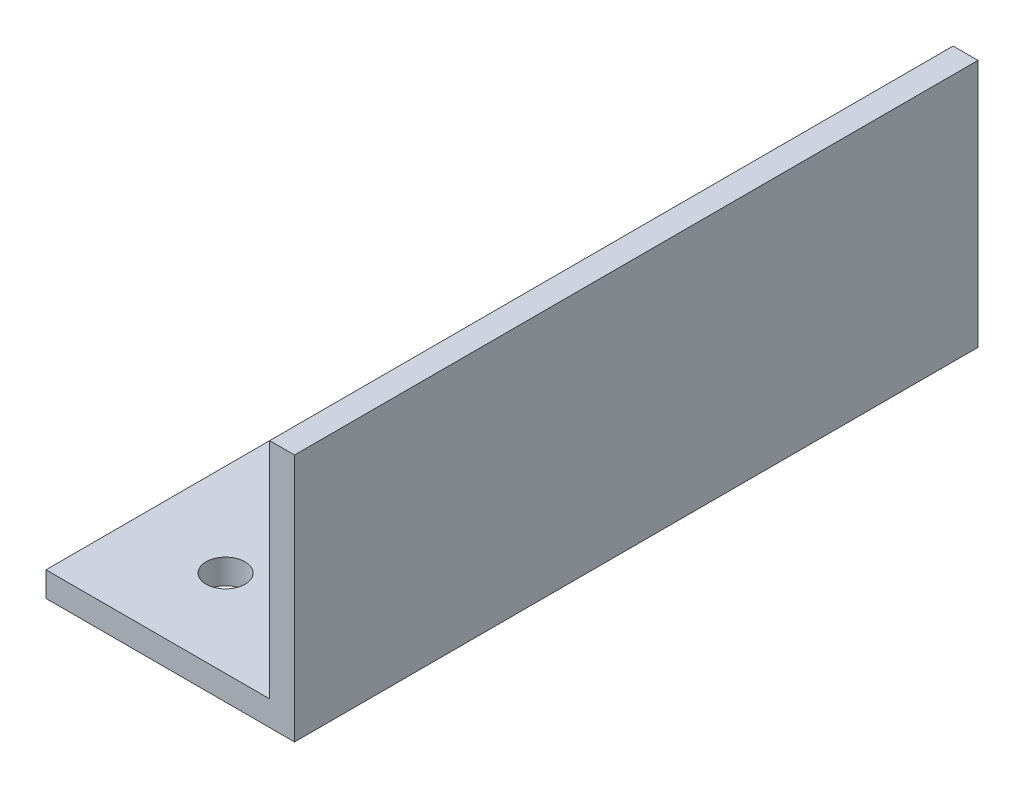
ISO-10303-21;
HEADER;
FILE_DESCRIPTION(('STEP AP214'),'2;1');
FILE_NAME('part.step','',(''),(''),'','','');
FILE_SCHEMA(('AUTOMOTIVE_DESIGN { 1 0 10303 214 1 1 1 1 }'));
ENDSEC;
DATA;
#1=APPLICATION_CONTEXT('core data for automotive mechanical design processes');
#2=APPLICATION_PROTOCOL_DEFINITION('international standard','automotive_design',2000,#1);
#3=PRODUCT_CONTEXT('',#1,'mechanical');
#4=PRODUCT('Part','Part','',(#3));
#5=PRODUCT_RELATED_PRODUCT_CATEGORY('part','',(#4));
#6=PRODUCT_DEFINITION_FORMATION('','',#4);
#7=PRODUCT_DEFINITION_CONTEXT('part definition',#1,'design');
#8=PRODUCT_DEFINITION('design','',#6,#7);
#9=PRODUCT_DEFINITION_SHAPE('','',#8);
#10=(LENGTH_UNIT() NAMED_UNIT(*) SI_UNIT(.MILLI.,.METRE.));
#11=(NAMED_UNIT(*) PLANE_ANGLE_UNIT() SI_UNIT($,.RADIAN.));
#12=(NAMED_UNIT(*) SI_UNIT($,.STERADIAN.) SOLID_ANGLE_UNIT());
#13=UNCERTAINTY_MEASURE_WITH_UNIT(LENGTH_MEASURE(1.E-05),#10,'distance_accuracy_value','');
#14=(GEOMETRIC_REPRESENTATION_CONTEXT(3) GLOBAL_UNCERTAINTY_ASSIGNED_CONTEXT((#13)) GLOBAL_UNIT_ASSIGNED_CONTEXT((#10,
#11,#12)) REPRESENTATION_CONTEXT('',''));
#15=CARTESIAN_POINT('',(0.,0.,0.));
#16=DIRECTION('',(0.,0.,1.));
#17=DIRECTION('',(1.,0.,0.));
#18=AXIS2_PLACEMENT_3D('',#15,#16,#17);
#19=CARTESIAN_POINT('',(-18.,0.,55.));
#20=DIRECTION('',(-1.,0.,0.));
#21=DIRECTION('',(0.,0.,1.));
#22=AXIS2_PLACEMENT_3D('',#19,#20,#21);
#23=PLANE('',#22);
#24=DIRECTION('',(0.,1.,0.));
#25=VECTOR('',#24,1.);
#26=CARTESIAN_POINT('',(-18.,0.,0.));
#27=LINE('',#26,#25);
#28=CARTESIAN_POINT('',(-18.,0.,0.));
#29=VERTEX_POINT('',#28);
#30=CARTESIAN_POINT('',(-18.,2.,0.));
#31=VERTEX_POINT('',#30);
#32=EDGE_CURVE('E132',#29,#31,#27,.T.);
#33=ORIENTED_EDGE('',*,*,#32,.F.);
#34=DIRECTION('',(0.,0.,-1.));
#35=VECTOR('',#34,1.);
#36=CARTESIAN_POINT('',(-18.,0.,55.));
#37=LINE('',#36,#35);
#38=CARTESIAN_POINT('',(-18.,0.,55.));
#39=VERTEX_POINT('',#38);
#40=EDGE_CURVE('E13',#39,#29,#37,.T.);
#41=ORIENTED_EDGE('',*,*,#40,.F.);
#42=DIRECTION('',(0.,1.,0.));
#43=VECTOR('',#42,1.);
#44=CARTESIAN_POINT('',(-18.,0.,55.));
#45=LINE('',#44,#43);
#46=CARTESIAN_POINT('',(-18.,2.,55.));
#47=VERTEX_POINT('',#46);
#48=EDGE_CURVE('E147',#39,#47,#45,.T.);
#49=ORIENTED_EDGE('',*,*,#48,.T.);
#50=DIRECTION('',(0.,0.,-1.));
#51=VECTOR('',#50,1.);
#52=CARTESIAN_POINT('',(-18.,2.,55.));
#53=LINE('',#52,#51);
#54=EDGE_CURVE('E95',#47,#31,#53,.T.);
#55=ORIENTED_EDGE('',*,*,#54,.T.);
#56=EDGE_LOOP('',(#33,#41,#49,#55));
#57=FACE_BOUND('',#56,.T.);
#58=ADVANCED_FACE('F49',(#57),#23,.T.);
#59=CARTESIAN_POINT('',(0.,0.,55.));
#60=DIRECTION('',(0.,-1.,0.));
#61=DIRECTION('',(1.,0.,0.));
#62=AXIS2_PLACEMENT_3D('',#59,#60,#61);
#63=PLANE('',#62);
#64=CARTESIAN_POINT('',(-10.5501572342593,0.,48.0000000000007));
#65=DIRECTION('',(0.,-1.,0.));
#66=DIRECTION('',(1.,0.,0.));
#67=AXIS2_PLACEMENT_3D('',#64,#65,#66);
#68=CIRCLE('',#67,1.5661800246503);
#69=CARTESIAN_POINT('',(-8.98397720960897,0.,48.0000000000007));
#70=VERTEX_POINT('',#69);
#71=EDGE_CURVE('E160',#70,#70,#68,.T.);
#72=ORIENTED_EDGE('',*,*,#71,.F.);
#73=EDGE_LOOP('',(#72));
#74=FACE_BOUND('',#73,.T.);
#75=CARTESIAN_POINT('',(-10.5501572342593,0.,7.00000000000067));
#76=DIRECTION('',(0.,-1.,0.));
#77=DIRECTION('',(1.,0.,0.));
#78=AXIS2_PLACEMENT_3D('',#75,#76,#77);
#79=CIRCLE('',#78,1.5661800246503);
#80=CARTESIAN_POINT('',(-8.98397720960897,0.,7.00000000000067));
#81=VERTEX_POINT('',#80);
#82=EDGE_CURVE('E152',#81,#81,#79,.T.);
#83=ORIENTED_EDGE('',*,*,#82,.F.);
#84=EDGE_LOOP('',(#83));
#85=FACE_BOUND('',#84,.T.);
#86=DIRECTION('',(-1.,0.,0.));
#87=VECTOR('',#86,1.);
#88=CARTESIAN_POINT('',(0.,0.,0.));
#89=LINE('',#88,#87);
#90=CARTESIAN_POINT('',(2.,0.,0.));
#91=VERTEX_POINT('',#90);
#92=EDGE_CURVE('E135',#91,#29,#89,.T.);
#93=ORIENTED_EDGE('',*,*,#92,.F.);
#94=DIRECTION('',(0.,0.,-1.));
#95=VECTOR('',#94,1.);
#96=CARTESIAN_POINT('',(2.,0.,55.));
#97=LINE('',#96,#95);
#98=CARTESIAN_POINT('',(2.,0.,55.));
#99=VERTEX_POINT('',#98);
#100=EDGE_CURVE('E58',#99,#91,#97,.T.);
#101=ORIENTED_EDGE('',*,*,#100,.F.);
#102=DIRECTION('',(-1.,0.,0.));
#103=VECTOR('',#102,1.);
#104=CARTESIAN_POINT('',(0.,0.,55.));
#105=LINE('',#104,#103);
#106=EDGE_CURVE('E164',#99,#39,#105,.T.);
#107=ORIENTED_EDGE('',*,*,#106,.T.);
#108=ORIENTED_EDGE('',*,*,#40,.T.);
#109=EDGE_LOOP('',(#93,#101,#107,#108));
#110=FACE_BOUND('',#109,.T.);
#111=ADVANCED_FACE('F168',(#74,#85,#110),#63,.T.);
#112=CARTESIAN_POINT('',(2.,0.,55.));
#113=DIRECTION('',(-1.,0.,0.));
#114=DIRECTION('',(0.,-1.,0.));
#115=AXIS2_PLACEMENT_3D('',#112,#113,#114);
#116=PLANE('',#115);
#117=DIRECTION('',(0.,1.,0.));
#118=VECTOR('',#117,1.);
#119=CARTESIAN_POINT('',(2.,0.,0.));
#120=LINE('',#119,#118);
#121=CARTESIAN_POINT('',(2.,20.,0.));
#122=VERTEX_POINT('',#121);
#123=EDGE_CURVE('E139',#91,#122,#120,.T.);
#124=ORIENTED_EDGE('',*,*,#123,.T.);
#125=DIRECTION('',(0.,0.,-1.));
#126=VECTOR('',#125,1.);
#127=CARTESIAN_POINT('',(2.,20.,55.));
#128=LINE('',#127,#126);
#129=CARTESIAN_POINT('',(2.,20.,55.));
#130=VERTEX_POINT('',#129);
#131=EDGE_CURVE('E118',#130,#122,#128,.T.);
#132=ORIENTED_EDGE('',*,*,#131,.F.);
#133=DIRECTION('',(0.,1.,0.));
#134=VECTOR('',#133,1.);
#135=CARTESIAN_POINT('',(2.,0.,55.));
#136=LINE('',#135,#134);
#137=EDGE_CURVE('E124',#99,#130,#136,.T.);
#138=ORIENTED_EDGE('',*,*,#137,.F.);
#139=ORIENTED_EDGE('',*,*,#100,.T.);
#140=EDGE_LOOP('',(#124,#132,#138,#139));
#141=FACE_BOUND('',#140,.T.);
#142=ADVANCED_FACE('F173',(#141),#116,.F.);
#143=CARTESIAN_POINT('',(0.,20.,55.));
#144=DIRECTION('',(0.,1.,0.));
#145=DIRECTION('',(0.,0.,1.));
#146=AXIS2_PLACEMENT_3D('',#143,#144,#145);
#147=PLANE('',#146);
#148=DIRECTION('',(1.,0.,0.));
#149=VECTOR('',#148,1.);
#150=CARTESIAN_POINT('',(0.,20.,0.));
#151=LINE('',#150,#149);
#152=CARTESIAN_POINT('',(0.,20.,0.));
#153=VERTEX_POINT('',#152);
#154=EDGE_CURVE('E113',#153,#122,#151,.T.);
#155=ORIENTED_EDGE('',*,*,#154,.F.);
#156=DIRECTION('',(0.,0.,-1.));
#157=VECTOR('',#156,1.);
#158=CARTESIAN_POINT('',(0.,20.,55.));
#159=LINE('',#158,#157);
#160=CARTESIAN_POINT('',(0.,20.,55.));
#161=VERTEX_POINT('',#160);
#162=EDGE_CURVE('E108',#161,#153,#159,.T.);
#163=ORIENTED_EDGE('',*,*,#162,.F.);
#164=DIRECTION('',(1.,0.,0.));
#165=VECTOR('',#164,1.);
#166=CARTESIAN_POINT('',(0.,20.,55.));
#167=LINE('',#166,#165);
#168=EDGE_CURVE('E111',#161,#130,#167,.T.);
#169=ORIENTED_EDGE('',*,*,#168,.T.);
#170=ORIENTED_EDGE('',*,*,#131,.T.);
#171=EDGE_LOOP('',(#155,#163,#169,#170));
#172=FACE_BOUND('',#171,.T.);
#173=ADVANCED_FACE('F110',(#172),#147,.T.);
#174=CARTESIAN_POINT('',(0.,0.,55.));
#175=DIRECTION('',(-1.,0.,0.));
#176=DIRECTION('',(0.,0.,1.));
#177=AXIS2_PLACEMENT_3D('',#174,#175,#176);
#178=PLANE('',#177);
#179=DIRECTION('',(0.,1.,0.));
#180=VECTOR('',#179,1.);
#181=CARTESIAN_POINT('',(0.,0.,0.));
#182=LINE('',#181,#180);
#183=CARTESIAN_POINT('',(0.,2.,0.));
#184=VERTEX_POINT('',#183);
#185=EDGE_CURVE('E143',#184,#153,#182,.T.);
#186=ORIENTED_EDGE('',*,*,#185,.F.);
#187=DIRECTION('',(0.,0.,-1.));
#188=VECTOR('',#187,1.);
#189=CARTESIAN_POINT('',(0.,2.,55.));
#190=LINE('',#189,#188);
#191=CARTESIAN_POINT('',(0.,2.,55.));
#192=VERTEX_POINT('',#191);
#193=EDGE_CURVE('E88',#192,#184,#190,.T.);
#194=ORIENTED_EDGE('',*,*,#193,.F.);
#195=DIRECTION('',(0.,1.,0.));
#196=VECTOR('',#195,1.);
#197=CARTESIAN_POINT('',(0.,0.,55.));
#198=LINE('',#197,#196);
#199=EDGE_CURVE('E121',#192,#161,#198,.T.);
#200=ORIENTED_EDGE('',*,*,#199,.T.);
#201=ORIENTED_EDGE('',*,*,#162,.T.);
#202=EDGE_LOOP('',(#186,#194,#200,#201));
#203=FACE_BOUND('',#202,.T.);
#204=ADVANCED_FACE('F127',(#203),#178,.T.);
#205=CARTESIAN_POINT('',(0.,2.,55.));
#206=DIRECTION('',(0.,-1.,0.));
#207=DIRECTION('',(1.,0.,0.));
#208=AXIS2_PLACEMENT_3D('',#205,#206,#207);
#209=PLANE('',#208);
#210=CARTESIAN_POINT('',(-10.5501572342593,2.,48.0000000000007));
#211=DIRECTION('',(0.,-1.,0.));
#212=DIRECTION('',(1.,0.,0.));
#213=AXIS2_PLACEMENT_3D('',#210,#211,#212);
#214=CIRCLE('',#213,1.5661800246503);
#215=CARTESIAN_POINT('',(-8.98397720960897,2.,48.0000000000007));
#216=VERTEX_POINT('',#215);
#217=EDGE_CURVE('E52',#216,#216,#214,.T.);
#218=ORIENTED_EDGE('',*,*,#217,.T.);
#219=EDGE_LOOP('',(#218));
#220=FACE_BOUND('',#219,.T.);
#221=CARTESIAN_POINT('',(-10.5501572342593,2.,7.00000000000067));
#222=DIRECTION('',(0.,-1.,0.));
#223=DIRECTION('',(1.,0.,0.));
#224=AXIS2_PLACEMENT_3D('',#221,#222,#223);
#225=CIRCLE('',#224,1.5661800246503);
#226=CARTESIAN_POINT('',(-8.98397720960897,2.,7.00000000000067));
#227=VERTEX_POINT('',#226);
#228=EDGE_CURVE('E136',#227,#227,#225,.T.);
#229=ORIENTED_EDGE('',*,*,#228,.T.);
#230=EDGE_LOOP('',(#229));
#231=FACE_BOUND('',#230,.T.);
#232=DIRECTION('',(-1.,0.,0.));
#233=VECTOR('',#232,1.);
#234=CARTESIAN_POINT('',(0.,2.,0.));
#235=LINE('',#234,#233);
#236=EDGE_CURVE('E145',#184,#31,#235,.T.);
#237=ORIENTED_EDGE('',*,*,#236,.T.);
#238=ORIENTED_EDGE('',*,*,#54,.F.);
#239=DIRECTION('',(-1.,0.,0.));
#240=VECTOR('',#239,1.);
#241=CARTESIAN_POINT('',(0.,2.,55.));
#242=LINE('',#241,#240);
#243=EDGE_CURVE('E67',#192,#47,#242,.T.);
#244=ORIENTED_EDGE('',*,*,#243,.F.);
#245=ORIENTED_EDGE('',*,*,#193,.T.);
#246=EDGE_LOOP('',(#237,#238,#244,#245));
#247=FACE_BOUND('',#246,.T.);
#248=ADVANCED_FACE('F187',(#220,#231,#247),#209,.F.);
#249=CARTESIAN_POINT('',(0.,0.,55.));
#250=DIRECTION('',(0.,0.,1.));
#251=DIRECTION('',(1.,0.,0.));
#252=AXIS2_PLACEMENT_3D('',#249,#250,#251);
#253=PLANE('',#252);
#254=ORIENTED_EDGE('',*,*,#48,.F.);
#255=ORIENTED_EDGE('',*,*,#106,.F.);
#256=ORIENTED_EDGE('',*,*,#137,.T.);
#257=ORIENTED_EDGE('',*,*,#168,.F.);
#258=ORIENTED_EDGE('',*,*,#199,.F.);
#259=ORIENTED_EDGE('',*,*,#243,.T.);
#260=EDGE_LOOP('',(#254,#255,#256,#257,#258,#259));
#261=FACE_BOUND('',#260,.T.);
#262=ADVANCED_FACE('F120',(#261),#253,.T.);
#263=CARTESIAN_POINT('',(0.,0.,0.));
#264=DIRECTION('',(0.,0.,1.));
#265=DIRECTION('',(1.,0.,0.));
#266=AXIS2_PLACEMENT_3D('',#263,#264,#265);
#267=PLANE('',#266);
#268=ORIENTED_EDGE('',*,*,#32,.T.);
#269=ORIENTED_EDGE('',*,*,#236,.F.);
#270=ORIENTED_EDGE('',*,*,#185,.T.);
#271=ORIENTED_EDGE('',*,*,#154,.T.);
#272=ORIENTED_EDGE('',*,*,#123,.F.);
#273=ORIENTED_EDGE('',*,*,#92,.T.);
#274=EDGE_LOOP('',(#268,#269,#270,#271,#272,#273));
#275=FACE_BOUND('',#274,.T.);
#276=ADVANCED_FACE('F191',(#275),#267,.F.);
#277=CARTESIAN_POINT('',(-10.5501572342593,10.,7.00000000000067));
#278=DIRECTION('',(0.,-1.,0.));
#279=DIRECTION('',(1.,0.,0.));
#280=AXIS2_PLACEMENT_3D('',#277,#278,#279);
#281=CYLINDRICAL_SURFACE('',#280,1.5661800246503);
#282=ORIENTED_EDGE('',*,*,#82,.T.);
#283=EDGE_LOOP('',(#282));
#284=FACE_BOUND('',#283,.T.);
#285=ORIENTED_EDGE('',*,*,#228,.F.);
#286=EDGE_LOOP('',(#285));
#287=FACE_BOUND('',#286,.T.);
#288=ADVANCED_FACE('F194',(#284,#287),#281,.F.);
#289=CARTESIAN_POINT('',(-10.5501572342593,10.,48.0000000000007));
#290=DIRECTION('',(0.,-1.,0.));
#291=DIRECTION('',(1.,0.,0.));
#292=AXIS2_PLACEMENT_3D('',#289,#290,#291);
#293=CYLINDRICAL_SURFACE('',#292,1.5661800246503);
#294=ORIENTED_EDGE('',*,*,#71,.T.);
#295=EDGE_LOOP('',(#294));
#296=FACE_BOUND('',#295,.T.);
#297=ORIENTED_EDGE('',*,*,#217,.F.);
#298=EDGE_LOOP('',(#297));
#299=FACE_BOUND('',#298,.T.);
#300=ADVANCED_FACE('F200',(#296,#299),#293,.F.);
#301=CLOSED_SHELL('',(#58,#111,#142,#173,#204,#248,#262,#276,#288,#300));
#302=MANIFOLD_SOLID_BREP('B2',#301);
#303=ADVANCED_BREP_SHAPE_REPRESENTATION('',(#18,#302),#14);
#304=SHAPE_DEFINITION_REPRESENTATION(#9,#303);
ENDSEC;
END-ISO-10303-21;
